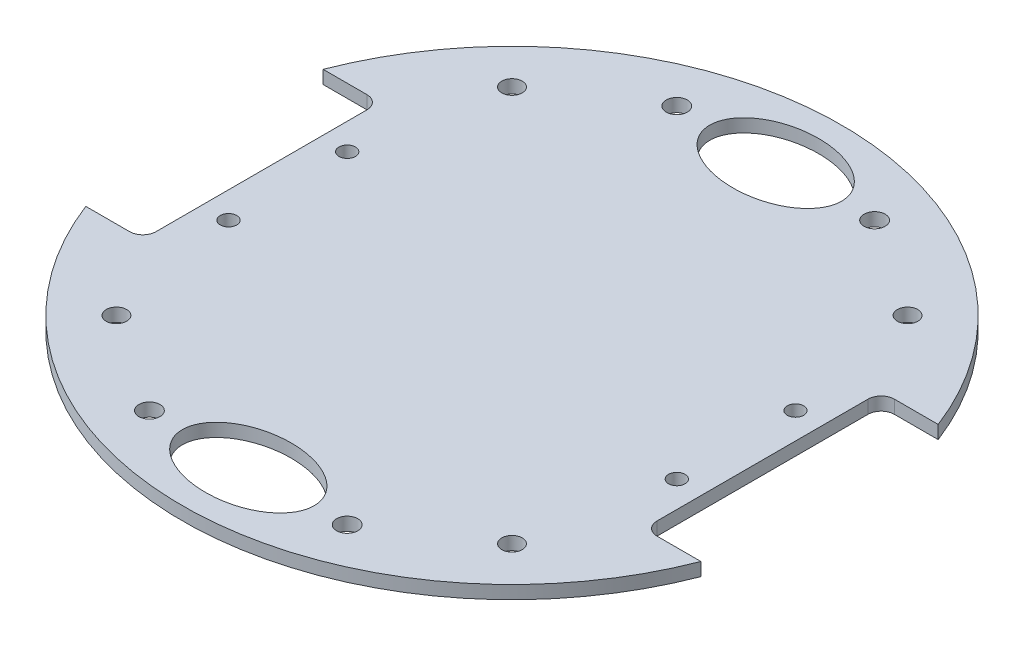
ISO-10303-21;
HEADER;
FILE_DESCRIPTION(('STEP AP214'),'2;1');
FILE_NAME('part.step','',(''),(''),'','','');
FILE_SCHEMA(('AUTOMOTIVE_DESIGN { 1 0 10303 214 1 1 1 1 }'));
ENDSEC;
DATA;
#1=APPLICATION_CONTEXT('core data for automotive mechanical design processes');
#2=APPLICATION_PROTOCOL_DEFINITION('international standard','automotive_design',2000,#1);
#3=PRODUCT_CONTEXT('',#1,'mechanical');
#4=PRODUCT('Part','Part','',(#3));
#5=PRODUCT_RELATED_PRODUCT_CATEGORY('part','',(#4));
#6=PRODUCT_DEFINITION_FORMATION('','',#4);
#7=PRODUCT_DEFINITION_CONTEXT('part definition',#1,'design');
#8=PRODUCT_DEFINITION('design','',#6,#7);
#9=PRODUCT_DEFINITION_SHAPE('','',#8);
#10=(LENGTH_UNIT() NAMED_UNIT(*) SI_UNIT(.MILLI.,.METRE.));
#11=(NAMED_UNIT(*) PLANE_ANGLE_UNIT() SI_UNIT($,.RADIAN.));
#12=(NAMED_UNIT(*) SI_UNIT($,.STERADIAN.) SOLID_ANGLE_UNIT());
#13=UNCERTAINTY_MEASURE_WITH_UNIT(LENGTH_MEASURE(1.E-05),#10,'distance_accuracy_value','');
#14=(GEOMETRIC_REPRESENTATION_CONTEXT(3) GLOBAL_UNCERTAINTY_ASSIGNED_CONTEXT((#13)) GLOBAL_UNIT_ASSIGNED_CONTEXT((#10,
#11,#12)) REPRESENTATION_CONTEXT('',''));
#15=CARTESIAN_POINT('',(0.,0.,0.));
#16=DIRECTION('',(0.,0.,1.));
#17=DIRECTION('',(1.,0.,0.));
#18=AXIS2_PLACEMENT_3D('',#15,#16,#17);
#19=CARTESIAN_POINT('',(46.6476151587624,2.,-18.));
#20=DIRECTION('',(0.,0.,1.));
#21=DIRECTION('',(1.,0.,0.));
#22=AXIS2_PLACEMENT_3D('',#19,#20,#21);
#23=PLANE('',#22);
#24=DIRECTION('',(-1.,0.,0.));
#25=VECTOR('',#24,1.);
#26=CARTESIAN_POINT('',(46.6476151587624,0.,-18.));
#27=LINE('',#26,#25);
#28=CARTESIAN_POINT('',(46.6476151587624,0.,-18.));
#29=VERTEX_POINT('',#28);
#30=CARTESIAN_POINT('',(40.,0.,-18.));
#31=VERTEX_POINT('',#30);
#32=EDGE_CURVE('E158',#29,#31,#27,.T.);
#33=ORIENTED_EDGE('',*,*,#32,.F.);
#34=DIRECTION('',(0.,-1.,0.));
#35=VECTOR('',#34,1.);
#36=CARTESIAN_POINT('',(46.6476151587624,2.,-18.));
#37=LINE('',#36,#35);
#38=CARTESIAN_POINT('',(46.6476151587624,2.,-18.));
#39=VERTEX_POINT('',#38);
#40=EDGE_CURVE('E11',#39,#29,#37,.T.);
#41=ORIENTED_EDGE('',*,*,#40,.F.);
#42=DIRECTION('',(-1.,0.,0.));
#43=VECTOR('',#42,1.);
#44=CARTESIAN_POINT('',(46.6476151587624,2.,-18.));
#45=LINE('',#44,#43);
#46=CARTESIAN_POINT('',(40.,2.,-18.));
#47=VERTEX_POINT('',#46);
#48=EDGE_CURVE('E186',#39,#47,#45,.T.);
#49=ORIENTED_EDGE('',*,*,#48,.T.);
#50=DIRECTION('',(0.,-1.,0.));
#51=VECTOR('',#50,1.);
#52=CARTESIAN_POINT('',(40.,2.,-18.));
#53=LINE('',#52,#51);
#54=EDGE_CURVE('E157',#47,#31,#53,.T.);
#55=ORIENTED_EDGE('',*,*,#54,.T.);
#56=EDGE_LOOP('',(#33,#41,#49,#55));
#57=FACE_BOUND('',#56,.T.);
#58=ADVANCED_FACE('F35',(#57),#23,.T.);
#59=CARTESIAN_POINT('',(0.,2.,0.));
#60=DIRECTION('',(0.,-1.,0.));
#61=DIRECTION('',(0.,0.,-1.));
#62=AXIS2_PLACEMENT_3D('',#59,#60,#61);
#63=CYLINDRICAL_SURFACE('',#62,50.);
#64=CARTESIAN_POINT('',(0.,0.,0.));
#65=DIRECTION('',(0.,1.,0.));
#66=DIRECTION('',(0.,0.,1.));
#67=AXIS2_PLACEMENT_3D('',#64,#65,#66);
#68=CIRCLE('',#67,50.);
#69=CARTESIAN_POINT('',(-46.6476151587624,0.,-18.));
#70=VERTEX_POINT('',#69);
#71=EDGE_CURVE('E92',#29,#70,#68,.T.);
#72=ORIENTED_EDGE('',*,*,#71,.T.);
#73=DIRECTION('',(0.,-1.,0.));
#74=VECTOR('',#73,1.);
#75=CARTESIAN_POINT('',(-46.6476151587624,2.,-18.));
#76=LINE('',#75,#74);
#77=CARTESIAN_POINT('',(-46.6476151587624,2.,-18.));
#78=VERTEX_POINT('',#77);
#79=EDGE_CURVE('E44',#78,#70,#76,.T.);
#80=ORIENTED_EDGE('',*,*,#79,.F.);
#81=CARTESIAN_POINT('',(0.,2.,0.));
#82=DIRECTION('',(0.,1.,0.));
#83=DIRECTION('',(0.,0.,1.));
#84=AXIS2_PLACEMENT_3D('',#81,#82,#83);
#85=CIRCLE('',#84,50.);
#86=EDGE_CURVE('E135',#39,#78,#85,.T.);
#87=ORIENTED_EDGE('',*,*,#86,.F.);
#88=ORIENTED_EDGE('',*,*,#40,.T.);
#89=EDGE_LOOP('',(#72,#80,#87,#88));
#90=FACE_BOUND('',#89,.T.);
#91=ADVANCED_FACE('F351',(#90),#63,.T.);
#92=CARTESIAN_POINT('',(-46.6476151587624,2.,-18.));
#93=DIRECTION('',(0.,0.,-1.));
#94=DIRECTION('',(-1.,0.,0.));
#95=AXIS2_PLACEMENT_3D('',#92,#93,#94);
#96=PLANE('',#95);
#97=DIRECTION('',(1.,0.,0.));
#98=VECTOR('',#97,1.);
#99=CARTESIAN_POINT('',(-46.6476151587624,0.,-18.));
#100=LINE('',#99,#98);
#101=CARTESIAN_POINT('',(-40.,0.,-18.));
#102=VERTEX_POINT('',#101);
#103=EDGE_CURVE('E142',#70,#102,#100,.T.);
#104=ORIENTED_EDGE('',*,*,#103,.T.);
#105=DIRECTION('',(0.,-1.,0.));
#106=VECTOR('',#105,1.);
#107=CARTESIAN_POINT('',(-40.,2.,-18.));
#108=LINE('',#107,#106);
#109=CARTESIAN_POINT('',(-40.,2.,-18.));
#110=VERTEX_POINT('',#109);
#111=EDGE_CURVE('E139',#110,#102,#108,.T.);
#112=ORIENTED_EDGE('',*,*,#111,.F.);
#113=DIRECTION('',(1.,0.,0.));
#114=VECTOR('',#113,1.);
#115=CARTESIAN_POINT('',(-46.6476151587624,2.,-18.));
#116=LINE('',#115,#114);
#117=EDGE_CURVE('E129',#78,#110,#116,.T.);
#118=ORIENTED_EDGE('',*,*,#117,.F.);
#119=ORIENTED_EDGE('',*,*,#79,.T.);
#120=EDGE_LOOP('',(#104,#112,#118,#119));
#121=FACE_BOUND('',#120,.T.);
#122=ADVANCED_FACE('F140',(#121),#96,.F.);
#123=CARTESIAN_POINT('',(-40.,2.,-16.));
#124=DIRECTION('',(0.,-1.,0.));
#125=DIRECTION('',(0.,0.,-1.));
#126=AXIS2_PLACEMENT_3D('',#123,#124,#125);
#127=CYLINDRICAL_SURFACE('',#126,2.);
#128=CARTESIAN_POINT('',(-40.,0.,-16.));
#129=DIRECTION('',(0.,-1.,0.));
#130=DIRECTION('',(0.,0.,-1.));
#131=AXIS2_PLACEMENT_3D('',#128,#129,#130);
#132=CIRCLE('',#131,2.);
#133=CARTESIAN_POINT('',(-38.,0.,-16.));
#134=VERTEX_POINT('',#133);
#135=EDGE_CURVE('E183',#102,#134,#132,.T.);
#136=ORIENTED_EDGE('',*,*,#135,.T.);
#137=DIRECTION('',(0.,-1.,0.));
#138=VECTOR('',#137,1.);
#139=CARTESIAN_POINT('',(-38.,2.,-16.));
#140=LINE('',#139,#138);
#141=CARTESIAN_POINT('',(-38.,2.,-16.));
#142=VERTEX_POINT('',#141);
#143=EDGE_CURVE('E145',#142,#134,#140,.T.);
#144=ORIENTED_EDGE('',*,*,#143,.F.);
#145=CARTESIAN_POINT('',(-40.,2.,-16.));
#146=DIRECTION('',(0.,-1.,0.));
#147=DIRECTION('',(0.,0.,-1.));
#148=AXIS2_PLACEMENT_3D('',#145,#146,#147);
#149=CIRCLE('',#148,2.);
#150=EDGE_CURVE('E133',#110,#142,#149,.T.);
#151=ORIENTED_EDGE('',*,*,#150,.F.);
#152=ORIENTED_EDGE('',*,*,#111,.T.);
#153=EDGE_LOOP('',(#136,#144,#151,#152));
#154=FACE_BOUND('',#153,.T.);
#155=ADVANCED_FACE('F147',(#154),#127,.F.);
#156=CARTESIAN_POINT('',(-38.,2.,-16.));
#157=DIRECTION('',(1.,0.,0.));
#158=DIRECTION('',(0.,0.,-1.));
#159=AXIS2_PLACEMENT_3D('',#156,#157,#158);
#160=PLANE('',#159);
#161=DIRECTION('',(0.,0.,1.));
#162=VECTOR('',#161,1.);
#163=CARTESIAN_POINT('',(-38.,0.,-16.));
#164=LINE('',#163,#162);
#165=CARTESIAN_POINT('',(-38.,0.,16.));
#166=VERTEX_POINT('',#165);
#167=EDGE_CURVE('E181',#134,#166,#164,.T.);
#168=ORIENTED_EDGE('',*,*,#167,.T.);
#169=DIRECTION('',(0.,-1.,0.));
#170=VECTOR('',#169,1.);
#171=CARTESIAN_POINT('',(-38.,2.,16.));
#172=LINE('',#171,#170);
#173=CARTESIAN_POINT('',(-38.,2.,16.));
#174=VERTEX_POINT('',#173);
#175=EDGE_CURVE('E190',#174,#166,#172,.T.);
#176=ORIENTED_EDGE('',*,*,#175,.F.);
#177=DIRECTION('',(0.,0.,1.));
#178=VECTOR('',#177,1.);
#179=CARTESIAN_POINT('',(-38.,2.,-16.));
#180=LINE('',#179,#178);
#181=EDGE_CURVE('E150',#142,#174,#180,.T.);
#182=ORIENTED_EDGE('',*,*,#181,.F.);
#183=ORIENTED_EDGE('',*,*,#143,.T.);
#184=EDGE_LOOP('',(#168,#176,#182,#183));
#185=FACE_BOUND('',#184,.T.);
#186=ADVANCED_FACE('F363',(#185),#160,.F.);
#187=CARTESIAN_POINT('',(-40.,2.,16.));
#188=DIRECTION('',(0.,-1.,0.));
#189=DIRECTION('',(0.,0.,-1.));
#190=AXIS2_PLACEMENT_3D('',#187,#188,#189);
#191=CYLINDRICAL_SURFACE('',#190,2.);
#192=CARTESIAN_POINT('',(-40.,0.,16.));
#193=DIRECTION('',(0.,-1.,0.));
#194=DIRECTION('',(0.,0.,-1.));
#195=AXIS2_PLACEMENT_3D('',#192,#193,#194);
#196=CIRCLE('',#195,2.);
#197=CARTESIAN_POINT('',(-40.,0.,18.));
#198=VERTEX_POINT('',#197);
#199=EDGE_CURVE('E179',#166,#198,#196,.T.);
#200=ORIENTED_EDGE('',*,*,#199,.T.);
#201=DIRECTION('',(0.,-1.,0.));
#202=VECTOR('',#201,1.);
#203=CARTESIAN_POINT('',(-40.,2.,18.));
#204=LINE('',#203,#202);
#205=CARTESIAN_POINT('',(-40.,2.,18.));
#206=VERTEX_POINT('',#205);
#207=EDGE_CURVE('E193',#206,#198,#204,.T.);
#208=ORIENTED_EDGE('',*,*,#207,.F.);
#209=CARTESIAN_POINT('',(-40.,2.,16.));
#210=DIRECTION('',(0.,-1.,0.));
#211=DIRECTION('',(0.,0.,-1.));
#212=AXIS2_PLACEMENT_3D('',#209,#210,#211);
#213=CIRCLE('',#212,2.);
#214=EDGE_CURVE('E152',#174,#206,#213,.T.);
#215=ORIENTED_EDGE('',*,*,#214,.F.);
#216=ORIENTED_EDGE('',*,*,#175,.T.);
#217=EDGE_LOOP('',(#200,#208,#215,#216));
#218=FACE_BOUND('',#217,.T.);
#219=ADVANCED_FACE('F325',(#218),#191,.F.);
#220=CARTESIAN_POINT('',(-40.,2.,18.));
#221=DIRECTION('',(0.,0.,1.));
#222=DIRECTION('',(1.,0.,0.));
#223=AXIS2_PLACEMENT_3D('',#220,#221,#222);
#224=PLANE('',#223);
#225=DIRECTION('',(-1.,0.,0.));
#226=VECTOR('',#225,1.);
#227=CARTESIAN_POINT('',(-40.,0.,18.));
#228=LINE('',#227,#226);
#229=CARTESIAN_POINT('',(-46.6476151587624,0.,18.));
#230=VERTEX_POINT('',#229);
#231=EDGE_CURVE('E177',#198,#230,#228,.T.);
#232=ORIENTED_EDGE('',*,*,#231,.T.);
#233=DIRECTION('',(0.,-1.,0.));
#234=VECTOR('',#233,1.);
#235=CARTESIAN_POINT('',(-46.6476151587624,2.,18.));
#236=LINE('',#235,#234);
#237=CARTESIAN_POINT('',(-46.6476151587624,2.,18.));
#238=VERTEX_POINT('',#237);
#239=EDGE_CURVE('E196',#238,#230,#236,.T.);
#240=ORIENTED_EDGE('',*,*,#239,.F.);
#241=DIRECTION('',(-1.,0.,0.));
#242=VECTOR('',#241,1.);
#243=CARTESIAN_POINT('',(-40.,2.,18.));
#244=LINE('',#243,#242);
#245=EDGE_CURVE('E318',#206,#238,#244,.T.);
#246=ORIENTED_EDGE('',*,*,#245,.F.);
#247=ORIENTED_EDGE('',*,*,#207,.T.);
#248=EDGE_LOOP('',(#232,#240,#246,#247));
#249=FACE_BOUND('',#248,.T.);
#250=ADVANCED_FACE('F329',(#249),#224,.F.);
#251=CARTESIAN_POINT('',(0.,2.,0.));
#252=DIRECTION('',(0.,-1.,0.));
#253=DIRECTION('',(0.,0.,-1.));
#254=AXIS2_PLACEMENT_3D('',#251,#252,#253);
#255=CYLINDRICAL_SURFACE('',#254,50.);
#256=CARTESIAN_POINT('',(0.,0.,0.));
#257=DIRECTION('',(0.,1.,0.));
#258=DIRECTION('',(0.,0.,1.));
#259=AXIS2_PLACEMENT_3D('',#256,#257,#258);
#260=CIRCLE('',#259,50.);
#261=CARTESIAN_POINT('',(46.6476151587624,0.,18.));
#262=VERTEX_POINT('',#261);
#263=EDGE_CURVE('E174',#230,#262,#260,.T.);
#264=ORIENTED_EDGE('',*,*,#263,.T.);
#265=DIRECTION('',(0.,-1.,0.));
#266=VECTOR('',#265,1.);
#267=CARTESIAN_POINT('',(46.6476151587624,2.,18.));
#268=LINE('',#267,#266);
#269=CARTESIAN_POINT('',(46.6476151587624,2.,18.));
#270=VERTEX_POINT('',#269);
#271=EDGE_CURVE('E199',#270,#262,#268,.T.);
#272=ORIENTED_EDGE('',*,*,#271,.F.);
#273=CARTESIAN_POINT('',(0.,2.,0.));
#274=DIRECTION('',(0.,1.,0.));
#275=DIRECTION('',(0.,0.,1.));
#276=AXIS2_PLACEMENT_3D('',#273,#274,#275);
#277=CIRCLE('',#276,50.);
#278=EDGE_CURVE('E316',#238,#270,#277,.T.);
#279=ORIENTED_EDGE('',*,*,#278,.F.);
#280=ORIENTED_EDGE('',*,*,#239,.T.);
#281=EDGE_LOOP('',(#264,#272,#279,#280));
#282=FACE_BOUND('',#281,.T.);
#283=ADVANCED_FACE('F334',(#282),#255,.T.);
#284=CARTESIAN_POINT('',(40.,2.,18.));
#285=DIRECTION('',(0.,0.,-1.));
#286=DIRECTION('',(-1.,0.,0.));
#287=AXIS2_PLACEMENT_3D('',#284,#285,#286);
#288=PLANE('',#287);
#289=DIRECTION('',(1.,0.,0.));
#290=VECTOR('',#289,1.);
#291=CARTESIAN_POINT('',(40.,0.,18.));
#292=LINE('',#291,#290);
#293=CARTESIAN_POINT('',(40.,0.,18.));
#294=VERTEX_POINT('',#293);
#295=EDGE_CURVE('E171',#294,#262,#292,.T.);
#296=ORIENTED_EDGE('',*,*,#295,.F.);
#297=DIRECTION('',(0.,-1.,0.));
#298=VECTOR('',#297,1.);
#299=CARTESIAN_POINT('',(40.,2.,18.));
#300=LINE('',#299,#298);
#301=CARTESIAN_POINT('',(40.,2.,18.));
#302=VERTEX_POINT('',#301);
#303=EDGE_CURVE('E201',#302,#294,#300,.T.);
#304=ORIENTED_EDGE('',*,*,#303,.F.);
#305=DIRECTION('',(1.,0.,0.));
#306=VECTOR('',#305,1.);
#307=CARTESIAN_POINT('',(40.,2.,18.));
#308=LINE('',#307,#306);
#309=EDGE_CURVE('E313',#302,#270,#308,.T.);
#310=ORIENTED_EDGE('',*,*,#309,.T.);
#311=ORIENTED_EDGE('',*,*,#271,.T.);
#312=EDGE_LOOP('',(#296,#304,#310,#311));
#313=FACE_BOUND('',#312,.T.);
#314=ADVANCED_FACE('F340',(#313),#288,.T.);
#315=CARTESIAN_POINT('',(40.,2.,16.));
#316=DIRECTION('',(0.,-1.,0.));
#317=DIRECTION('',(0.,0.,-1.));
#318=AXIS2_PLACEMENT_3D('',#315,#316,#317);
#319=CYLINDRICAL_SURFACE('',#318,2.);
#320=CARTESIAN_POINT('',(40.,0.,16.));
#321=DIRECTION('',(0.,-1.,0.));
#322=DIRECTION('',(0.,0.,-1.));
#323=AXIS2_PLACEMENT_3D('',#320,#321,#322);
#324=CIRCLE('',#323,2.);
#325=CARTESIAN_POINT('',(38.,0.,16.));
#326=VERTEX_POINT('',#325);
#327=EDGE_CURVE('E168',#294,#326,#324,.T.);
#328=ORIENTED_EDGE('',*,*,#327,.T.);
#329=DIRECTION('',(0.,-1.,0.));
#330=VECTOR('',#329,1.);
#331=CARTESIAN_POINT('',(38.,2.,16.));
#332=LINE('',#331,#330);
#333=CARTESIAN_POINT('',(38.,2.,16.));
#334=VERTEX_POINT('',#333);
#335=EDGE_CURVE('E203',#334,#326,#332,.T.);
#336=ORIENTED_EDGE('',*,*,#335,.F.);
#337=CARTESIAN_POINT('',(40.,2.,16.));
#338=DIRECTION('',(0.,-1.,0.));
#339=DIRECTION('',(0.,0.,-1.));
#340=AXIS2_PLACEMENT_3D('',#337,#338,#339);
#341=CIRCLE('',#340,2.);
#342=EDGE_CURVE('E311',#302,#334,#341,.T.);
#343=ORIENTED_EDGE('',*,*,#342,.F.);
#344=ORIENTED_EDGE('',*,*,#303,.T.);
#345=EDGE_LOOP('',(#328,#336,#343,#344));
#346=FACE_BOUND('',#345,.T.);
#347=ADVANCED_FACE('F343',(#346),#319,.F.);
#348=CARTESIAN_POINT('',(38.,2.,-16.));
#349=DIRECTION('',(1.,0.,0.));
#350=DIRECTION('',(0.,0.,-1.));
#351=AXIS2_PLACEMENT_3D('',#348,#349,#350);
#352=PLANE('',#351);
#353=DIRECTION('',(0.,0.,1.));
#354=VECTOR('',#353,1.);
#355=CARTESIAN_POINT('',(38.,0.,-16.));
#356=LINE('',#355,#354);
#357=CARTESIAN_POINT('',(38.,0.,-16.));
#358=VERTEX_POINT('',#357);
#359=EDGE_CURVE('E165',#358,#326,#356,.T.);
#360=ORIENTED_EDGE('',*,*,#359,.F.);
#361=DIRECTION('',(0.,-1.,0.));
#362=VECTOR('',#361,1.);
#363=CARTESIAN_POINT('',(38.,2.,-16.));
#364=LINE('',#363,#362);
#365=CARTESIAN_POINT('',(38.,2.,-16.));
#366=VERTEX_POINT('',#365);
#367=EDGE_CURVE('E205',#366,#358,#364,.T.);
#368=ORIENTED_EDGE('',*,*,#367,.F.);
#369=DIRECTION('',(0.,0.,1.));
#370=VECTOR('',#369,1.);
#371=CARTESIAN_POINT('',(38.,2.,-16.));
#372=LINE('',#371,#370);
#373=EDGE_CURVE('E308',#366,#334,#372,.T.);
#374=ORIENTED_EDGE('',*,*,#373,.T.);
#375=ORIENTED_EDGE('',*,*,#335,.T.);
#376=EDGE_LOOP('',(#360,#368,#374,#375));
#377=FACE_BOUND('',#376,.T.);
#378=ADVANCED_FACE('F346',(#377),#352,.T.);
#379=CARTESIAN_POINT('',(40.,2.,-16.));
#380=DIRECTION('',(0.,-1.,0.));
#381=DIRECTION('',(0.,0.,-1.));
#382=AXIS2_PLACEMENT_3D('',#379,#380,#381);
#383=CYLINDRICAL_SURFACE('',#382,2.);
#384=CARTESIAN_POINT('',(40.,0.,-16.));
#385=DIRECTION('',(0.,-1.,0.));
#386=DIRECTION('',(0.,0.,-1.));
#387=AXIS2_PLACEMENT_3D('',#384,#385,#386);
#388=CIRCLE('',#387,2.);
#389=EDGE_CURVE('E161',#358,#31,#388,.T.);
#390=ORIENTED_EDGE('',*,*,#389,.T.);
#391=ORIENTED_EDGE('',*,*,#54,.F.);
#392=CARTESIAN_POINT('',(40.,2.,-16.));
#393=DIRECTION('',(0.,-1.,0.));
#394=DIRECTION('',(0.,0.,-1.));
#395=AXIS2_PLACEMENT_3D('',#392,#393,#394);
#396=CIRCLE('',#395,2.);
#397=EDGE_CURVE('E102',#366,#47,#396,.T.);
#398=ORIENTED_EDGE('',*,*,#397,.F.);
#399=ORIENTED_EDGE('',*,*,#367,.T.);
#400=EDGE_LOOP('',(#390,#391,#398,#399));
#401=FACE_BOUND('',#400,.T.);
#402=ADVANCED_FACE('F349',(#401),#383,.F.);
#403=CARTESIAN_POINT('',(40.,2.,-16.));
#404=DIRECTION('',(0.,-1.,0.));
#405=DIRECTION('',(0.,0.,-1.));
#406=AXIS2_PLACEMENT_3D('',#403,#404,#405);
#407=PLANE('',#406);
#408=CARTESIAN_POINT('',(34.,2.,-9.));
#409=DIRECTION('',(0.,1.,0.));
#410=DIRECTION('',(0.,0.,-1.));
#411=AXIS2_PLACEMENT_3D('',#408,#409,#410);
#412=CIRCLE('',#411,1.25);
#413=CARTESIAN_POINT('',(34.,2.,-10.25));
#414=VERTEX_POINT('',#413);
#415=EDGE_CURVE('E260',#414,#414,#412,.T.);
#416=ORIENTED_EDGE('',*,*,#415,.F.);
#417=EDGE_LOOP('',(#416));
#418=FACE_BOUND('',#417,.T.);
#419=CARTESIAN_POINT('',(34.,2.,9.));
#420=DIRECTION('',(0.,1.,0.));
#421=DIRECTION('',(0.,0.,1.));
#422=AXIS2_PLACEMENT_3D('',#419,#420,#421);
#423=CIRCLE('',#422,1.25);
#424=CARTESIAN_POINT('',(34.,2.,10.25));
#425=VERTEX_POINT('',#424);
#426=EDGE_CURVE('E250',#425,#425,#423,.T.);
#427=ORIENTED_EDGE('',*,*,#426,.F.);
#428=EDGE_LOOP('',(#427));
#429=FACE_BOUND('',#428,.T.);
#430=CARTESIAN_POINT('',(-34.,2.,9.));
#431=DIRECTION('',(0.,1.,0.));
#432=DIRECTION('',(0.,0.,-1.));
#433=AXIS2_PLACEMENT_3D('',#430,#431,#432);
#434=CIRCLE('',#433,1.25);
#435=CARTESIAN_POINT('',(-34.,2.,7.75));
#436=VERTEX_POINT('',#435);
#437=EDGE_CURVE('E247',#436,#436,#434,.T.);
#438=ORIENTED_EDGE('',*,*,#437,.F.);
#439=EDGE_LOOP('',(#438));
#440=FACE_BOUND('',#439,.T.);
#441=CARTESIAN_POINT('',(-34.,2.,-9.));
#442=DIRECTION('',(0.,1.,0.));
#443=DIRECTION('',(0.,0.,1.));
#444=AXIS2_PLACEMENT_3D('',#441,#442,#443);
#445=CIRCLE('',#444,1.25);
#446=CARTESIAN_POINT('',(-34.,2.,-7.75));
#447=VERTEX_POINT('',#446);
#448=EDGE_CURVE('E244',#447,#447,#445,.T.);
#449=ORIENTED_EDGE('',*,*,#448,.F.);
#450=EDGE_LOOP('',(#449));
#451=FACE_BOUND('',#450,.T.);
#452=CARTESIAN_POINT('',(-15.,2.,40.));
#453=DIRECTION('',(0.,1.,0.));
#454=DIRECTION('',(0.,0.,-1.));
#455=AXIS2_PLACEMENT_3D('',#452,#453,#454);
#456=CIRCLE('',#455,1.6);
#457=CARTESIAN_POINT('',(-15.,2.,38.4));
#458=VERTEX_POINT('',#457);
#459=EDGE_CURVE('E240',#458,#458,#456,.T.);
#460=ORIENTED_EDGE('',*,*,#459,.F.);
#461=EDGE_LOOP('',(#460));
#462=FACE_BOUND('',#461,.T.);
#463=CARTESIAN_POINT('',(15.,2.,40.));
#464=DIRECTION('',(0.,1.,0.));
#465=DIRECTION('',(0.,0.,1.));
#466=AXIS2_PLACEMENT_3D('',#463,#464,#465);
#467=CIRCLE('',#466,1.6);
#468=CARTESIAN_POINT('',(15.,2.,41.6));
#469=VERTEX_POINT('',#468);
#470=EDGE_CURVE('E236',#469,#469,#467,.T.);
#471=ORIENTED_EDGE('',*,*,#470,.F.);
#472=EDGE_LOOP('',(#471));
#473=FACE_BOUND('',#472,.T.);
#474=CARTESIAN_POINT('',(15.,2.,-40.));
#475=DIRECTION('',(0.,1.,0.));
#476=DIRECTION('',(0.,0.,-1.));
#477=AXIS2_PLACEMENT_3D('',#474,#475,#476);
#478=CIRCLE('',#477,1.6);
#479=CARTESIAN_POINT('',(15.,2.,-41.6));
#480=VERTEX_POINT('',#479);
#481=EDGE_CURVE('E232',#480,#480,#478,.T.);
#482=ORIENTED_EDGE('',*,*,#481,.F.);
#483=EDGE_LOOP('',(#482));
#484=FACE_BOUND('',#483,.T.);
#485=CARTESIAN_POINT('',(-15.,2.,-40.));
#486=DIRECTION('',(0.,1.,0.));
#487=DIRECTION('',(0.,0.,1.));
#488=AXIS2_PLACEMENT_3D('',#485,#486,#487);
#489=CIRCLE('',#488,1.6);
#490=CARTESIAN_POINT('',(-15.,2.,-38.4));
#491=VERTEX_POINT('',#490);
#492=EDGE_CURVE('E228',#491,#491,#489,.T.);
#493=ORIENTED_EDGE('',*,*,#492,.F.);
#494=EDGE_LOOP('',(#493));
#495=FACE_BOUND('',#494,.T.);
#496=CARTESIAN_POINT('',(-30.,2.,30.));
#497=DIRECTION('',(0.,1.,0.));
#498=DIRECTION('',(0.,0.,-1.));
#499=AXIS2_PLACEMENT_3D('',#496,#497,#498);
#500=CIRCLE('',#499,1.55);
#501=CARTESIAN_POINT('',(-30.,2.,28.45));
#502=VERTEX_POINT('',#501);
#503=EDGE_CURVE('E224',#502,#502,#500,.T.);
#504=ORIENTED_EDGE('',*,*,#503,.F.);
#505=EDGE_LOOP('',(#504));
#506=FACE_BOUND('',#505,.T.);
#507=CARTESIAN_POINT('',(30.,2.,30.));
#508=DIRECTION('',(0.,1.,0.));
#509=DIRECTION('',(0.,0.,1.));
#510=AXIS2_PLACEMENT_3D('',#507,#508,#509);
#511=CIRCLE('',#510,1.55);
#512=CARTESIAN_POINT('',(30.,2.,31.55));
#513=VERTEX_POINT('',#512);
#514=EDGE_CURVE('E220',#513,#513,#511,.T.);
#515=ORIENTED_EDGE('',*,*,#514,.F.);
#516=EDGE_LOOP('',(#515));
#517=FACE_BOUND('',#516,.T.);
#518=CARTESIAN_POINT('',(30.,2.,-30.));
#519=DIRECTION('',(0.,1.,0.));
#520=DIRECTION('',(0.,0.,-1.));
#521=AXIS2_PLACEMENT_3D('',#518,#519,#520);
#522=CIRCLE('',#521,1.55);
#523=CARTESIAN_POINT('',(30.,2.,-31.55));
#524=VERTEX_POINT('',#523);
#525=EDGE_CURVE('E216',#524,#524,#522,.T.);
#526=ORIENTED_EDGE('',*,*,#525,.F.);
#527=EDGE_LOOP('',(#526));
#528=FACE_BOUND('',#527,.T.);
#529=CARTESIAN_POINT('',(-30.,2.,-30.));
#530=DIRECTION('',(0.,1.,0.));
#531=DIRECTION('',(0.,0.,1.));
#532=AXIS2_PLACEMENT_3D('',#529,#530,#531);
#533=CIRCLE('',#532,1.55);
#534=CARTESIAN_POINT('',(-30.,2.,-28.45));
#535=VERTEX_POINT('',#534);
#536=EDGE_CURVE('E212',#535,#535,#533,.T.);
#537=ORIENTED_EDGE('',*,*,#536,.F.);
#538=EDGE_LOOP('',(#537));
#539=FACE_BOUND('',#538,.T.);
#540=CARTESIAN_POINT('',(0.,2.,40.));
#541=DIRECTION('',(0.,1.,0.));
#542=DIRECTION('',(-1.,0.,0.));
#543=AXIS2_PLACEMENT_3D('',#540,#541,#542);
#544=ELLIPSE('',#543,10.,6.5);
#545=CARTESIAN_POINT('',(-10.,2.,40.));
#546=VERTEX_POINT('',#545);
#547=EDGE_CURVE('E211',#546,#546,#544,.T.);
#548=ORIENTED_EDGE('',*,*,#547,.F.);
#549=EDGE_LOOP('',(#548));
#550=FACE_BOUND('',#549,.T.);
#551=CARTESIAN_POINT('',(0.,2.,-40.));
#552=DIRECTION('',(0.,1.,0.));
#553=DIRECTION('',(-1.,0.,0.));
#554=AXIS2_PLACEMENT_3D('',#551,#552,#553);
#555=ELLIPSE('',#554,10.,6.5);
#556=CARTESIAN_POINT('',(-10.,2.,-40.));
#557=VERTEX_POINT('',#556);
#558=EDGE_CURVE('E285',#557,#557,#555,.T.);
#559=ORIENTED_EDGE('',*,*,#558,.F.);
#560=EDGE_LOOP('',(#559));
#561=FACE_BOUND('',#560,.T.);
#562=ORIENTED_EDGE('',*,*,#48,.F.);
#563=ORIENTED_EDGE('',*,*,#86,.T.);
#564=ORIENTED_EDGE('',*,*,#117,.T.);
#565=ORIENTED_EDGE('',*,*,#150,.T.);
#566=ORIENTED_EDGE('',*,*,#181,.T.);
#567=ORIENTED_EDGE('',*,*,#214,.T.);
#568=ORIENTED_EDGE('',*,*,#245,.T.);
#569=ORIENTED_EDGE('',*,*,#278,.T.);
#570=ORIENTED_EDGE('',*,*,#309,.F.);
#571=ORIENTED_EDGE('',*,*,#342,.T.);
#572=ORIENTED_EDGE('',*,*,#373,.F.);
#573=ORIENTED_EDGE('',*,*,#397,.T.);
#574=EDGE_LOOP('',(#562,#563,#564,#565,#566,#567,#568,#569,#570,#571,#572,#573));
#575=FACE_BOUND('',#574,.T.);
#576=ADVANCED_FACE('F131',(#418,#429,#440,#451,#462,#473,#484,#495,#506,#517,#528,#539,#550,
#561,#575),#407,.F.);
#577=CARTESIAN_POINT('',(40.,0.,-16.));
#578=DIRECTION('',(0.,-1.,0.));
#579=DIRECTION('',(0.,0.,-1.));
#580=AXIS2_PLACEMENT_3D('',#577,#578,#579);
#581=PLANE('',#580);
#582=CARTESIAN_POINT('',(34.,0.,-9.));
#583=DIRECTION('',(0.,-1.,0.));
#584=DIRECTION('',(0.,0.,-1.));
#585=AXIS2_PLACEMENT_3D('',#582,#583,#584);
#586=CIRCLE('',#585,1.25);
#587=CARTESIAN_POINT('',(34.,0.,-10.25));
#588=VERTEX_POINT('',#587);
#589=EDGE_CURVE('E38',#588,#588,#586,.T.);
#590=ORIENTED_EDGE('',*,*,#589,.F.);
#591=EDGE_LOOP('',(#590));
#592=FACE_BOUND('',#591,.T.);
#593=CARTESIAN_POINT('',(34.,0.,9.));
#594=DIRECTION('',(0.,-1.,0.));
#595=DIRECTION('',(0.,0.,-1.));
#596=AXIS2_PLACEMENT_3D('',#593,#594,#595);
#597=CIRCLE('',#596,1.25);
#598=CARTESIAN_POINT('',(34.,0.,7.75));
#599=VERTEX_POINT('',#598);
#600=EDGE_CURVE('E248',#599,#599,#597,.T.);
#601=ORIENTED_EDGE('',*,*,#600,.F.);
#602=EDGE_LOOP('',(#601));
#603=FACE_BOUND('',#602,.T.);
#604=CARTESIAN_POINT('',(-34.,0.,9.));
#605=DIRECTION('',(0.,-1.,0.));
#606=DIRECTION('',(0.,0.,-1.));
#607=AXIS2_PLACEMENT_3D('',#604,#605,#606);
#608=CIRCLE('',#607,1.25);
#609=CARTESIAN_POINT('',(-34.,0.,7.75));
#610=VERTEX_POINT('',#609);
#611=EDGE_CURVE('E245',#610,#610,#608,.T.);
#612=ORIENTED_EDGE('',*,*,#611,.F.);
#613=EDGE_LOOP('',(#612));
#614=FACE_BOUND('',#613,.T.);
#615=CARTESIAN_POINT('',(-34.,0.,-9.));
#616=DIRECTION('',(0.,-1.,0.));
#617=DIRECTION('',(0.,0.,-1.));
#618=AXIS2_PLACEMENT_3D('',#615,#616,#617);
#619=CIRCLE('',#618,1.25);
#620=CARTESIAN_POINT('',(-34.,0.,-10.25));
#621=VERTEX_POINT('',#620);
#622=EDGE_CURVE('E241',#621,#621,#619,.T.);
#623=ORIENTED_EDGE('',*,*,#622,.F.);
#624=EDGE_LOOP('',(#623));
#625=FACE_BOUND('',#624,.T.);
#626=CARTESIAN_POINT('',(-15.,0.,40.));
#627=DIRECTION('',(0.,-1.,0.));
#628=DIRECTION('',(0.,0.,-1.));
#629=AXIS2_PLACEMENT_3D('',#626,#627,#628);
#630=CIRCLE('',#629,1.6);
#631=CARTESIAN_POINT('',(-15.,0.,38.4));
#632=VERTEX_POINT('',#631);
#633=EDGE_CURVE('E237',#632,#632,#630,.T.);
#634=ORIENTED_EDGE('',*,*,#633,.F.);
#635=EDGE_LOOP('',(#634));
#636=FACE_BOUND('',#635,.T.);
#637=CARTESIAN_POINT('',(15.,0.,40.));
#638=DIRECTION('',(0.,-1.,0.));
#639=DIRECTION('',(0.,0.,-1.));
#640=AXIS2_PLACEMENT_3D('',#637,#638,#639);
#641=CIRCLE('',#640,1.6);
#642=CARTESIAN_POINT('',(15.,0.,38.4));
#643=VERTEX_POINT('',#642);
#644=EDGE_CURVE('E233',#643,#643,#641,.T.);
#645=ORIENTED_EDGE('',*,*,#644,.F.);
#646=EDGE_LOOP('',(#645));
#647=FACE_BOUND('',#646,.T.);
#648=CARTESIAN_POINT('',(15.,0.,-40.));
#649=DIRECTION('',(0.,-1.,0.));
#650=DIRECTION('',(0.,0.,-1.));
#651=AXIS2_PLACEMENT_3D('',#648,#649,#650);
#652=CIRCLE('',#651,1.6);
#653=CARTESIAN_POINT('',(15.,0.,-41.6));
#654=VERTEX_POINT('',#653);
#655=EDGE_CURVE('E229',#654,#654,#652,.T.);
#656=ORIENTED_EDGE('',*,*,#655,.F.);
#657=EDGE_LOOP('',(#656));
#658=FACE_BOUND('',#657,.T.);
#659=CARTESIAN_POINT('',(-15.,0.,-40.));
#660=DIRECTION('',(0.,-1.,0.));
#661=DIRECTION('',(0.,0.,-1.));
#662=AXIS2_PLACEMENT_3D('',#659,#660,#661);
#663=CIRCLE('',#662,1.6);
#664=CARTESIAN_POINT('',(-15.,0.,-41.6));
#665=VERTEX_POINT('',#664);
#666=EDGE_CURVE('E225',#665,#665,#663,.T.);
#667=ORIENTED_EDGE('',*,*,#666,.F.);
#668=EDGE_LOOP('',(#667));
#669=FACE_BOUND('',#668,.T.);
#670=CARTESIAN_POINT('',(-30.,0.,30.));
#671=DIRECTION('',(0.,-1.,0.));
#672=DIRECTION('',(0.,0.,-1.));
#673=AXIS2_PLACEMENT_3D('',#670,#671,#672);
#674=CIRCLE('',#673,1.55);
#675=CARTESIAN_POINT('',(-30.,0.,28.45));
#676=VERTEX_POINT('',#675);
#677=EDGE_CURVE('E221',#676,#676,#674,.T.);
#678=ORIENTED_EDGE('',*,*,#677,.F.);
#679=EDGE_LOOP('',(#678));
#680=FACE_BOUND('',#679,.T.);
#681=CARTESIAN_POINT('',(30.,0.,30.));
#682=DIRECTION('',(0.,-1.,0.));
#683=DIRECTION('',(0.,0.,-1.));
#684=AXIS2_PLACEMENT_3D('',#681,#682,#683);
#685=CIRCLE('',#684,1.55);
#686=CARTESIAN_POINT('',(30.,0.,28.45));
#687=VERTEX_POINT('',#686);
#688=EDGE_CURVE('E217',#687,#687,#685,.T.);
#689=ORIENTED_EDGE('',*,*,#688,.F.);
#690=EDGE_LOOP('',(#689));
#691=FACE_BOUND('',#690,.T.);
#692=CARTESIAN_POINT('',(30.,0.,-30.));
#693=DIRECTION('',(0.,-1.,0.));
#694=DIRECTION('',(0.,0.,-1.));
#695=AXIS2_PLACEMENT_3D('',#692,#693,#694);
#696=CIRCLE('',#695,1.55);
#697=CARTESIAN_POINT('',(30.,0.,-31.55));
#698=VERTEX_POINT('',#697);
#699=EDGE_CURVE('E213',#698,#698,#696,.T.);
#700=ORIENTED_EDGE('',*,*,#699,.F.);
#701=EDGE_LOOP('',(#700));
#702=FACE_BOUND('',#701,.T.);
#703=CARTESIAN_POINT('',(-30.,0.,-30.));
#704=DIRECTION('',(0.,-1.,0.));
#705=DIRECTION('',(0.,0.,-1.));
#706=AXIS2_PLACEMENT_3D('',#703,#704,#705);
#707=CIRCLE('',#706,1.55);
#708=CARTESIAN_POINT('',(-30.,0.,-31.55));
#709=VERTEX_POINT('',#708);
#710=EDGE_CURVE('E208',#709,#709,#707,.T.);
#711=ORIENTED_EDGE('',*,*,#710,.F.);
#712=EDGE_LOOP('',(#711));
#713=FACE_BOUND('',#712,.T.);
#714=CARTESIAN_POINT('',(0.,0.,40.));
#715=DIRECTION('',(0.,1.,0.));
#716=DIRECTION('',(-1.,0.,0.));
#717=AXIS2_PLACEMENT_3D('',#714,#715,#716);
#718=ELLIPSE('',#717,10.,6.5);
#719=CARTESIAN_POINT('',(-10.,0.,40.));
#720=VERTEX_POINT('',#719);
#721=EDGE_CURVE('E281',#720,#720,#718,.T.);
#722=ORIENTED_EDGE('',*,*,#721,.T.);
#723=EDGE_LOOP('',(#722));
#724=FACE_BOUND('',#723,.T.);
#725=CARTESIAN_POINT('',(0.,0.,-40.));
#726=DIRECTION('',(0.,1.,0.));
#727=DIRECTION('',(-1.,0.,0.));
#728=AXIS2_PLACEMENT_3D('',#725,#726,#727);
#729=ELLIPSE('',#728,10.,6.5);
#730=CARTESIAN_POINT('',(-10.,0.,-40.));
#731=VERTEX_POINT('',#730);
#732=EDGE_CURVE('E162',#731,#731,#729,.T.);
#733=ORIENTED_EDGE('',*,*,#732,.T.);
#734=EDGE_LOOP('',(#733));
#735=FACE_BOUND('',#734,.T.);
#736=ORIENTED_EDGE('',*,*,#32,.T.);
#737=ORIENTED_EDGE('',*,*,#389,.F.);
#738=ORIENTED_EDGE('',*,*,#359,.T.);
#739=ORIENTED_EDGE('',*,*,#327,.F.);
#740=ORIENTED_EDGE('',*,*,#295,.T.);
#741=ORIENTED_EDGE('',*,*,#263,.F.);
#742=ORIENTED_EDGE('',*,*,#231,.F.);
#743=ORIENTED_EDGE('',*,*,#199,.F.);
#744=ORIENTED_EDGE('',*,*,#167,.F.);
#745=ORIENTED_EDGE('',*,*,#135,.F.);
#746=ORIENTED_EDGE('',*,*,#103,.F.);
#747=ORIENTED_EDGE('',*,*,#71,.F.);
#748=EDGE_LOOP('',(#736,#737,#738,#739,#740,#741,#742,#743,#744,#745,#746,#747));
#749=FACE_BOUND('',#748,.T.);
#750=ADVANCED_FACE('F298',(#592,#603,#614,#625,#636,#647,#658,#669,#680,#691,#702,#713,#724,
#735,#749),#581,.T.);
#751=DIRECTION('',(0.,1.,0.));
#752=VECTOR('',#751,1.);
#753=SURFACE_OF_LINEAR_EXTRUSION('',#729,#752);
#754=ORIENTED_EDGE('',*,*,#732,.F.);
#755=EDGE_LOOP('',(#754));
#756=FACE_BOUND('',#755,.T.);
#757=ORIENTED_EDGE('',*,*,#558,.T.);
#758=EDGE_LOOP('',(#757));
#759=FACE_BOUND('',#758,.T.);
#760=ADVANCED_FACE('F293',(#756,#759),#753,.F.);
#761=DIRECTION('',(0.,1.,0.));
#762=VECTOR('',#761,1.);
#763=SURFACE_OF_LINEAR_EXTRUSION('',#718,#762);
#764=ORIENTED_EDGE('',*,*,#721,.F.);
#765=EDGE_LOOP('',(#764));
#766=FACE_BOUND('',#765,.T.);
#767=ORIENTED_EDGE('',*,*,#547,.T.);
#768=EDGE_LOOP('',(#767));
#769=FACE_BOUND('',#768,.T.);
#770=ADVANCED_FACE('F288',(#766,#769),#763,.F.);
#771=CARTESIAN_POINT('',(-30.,-8.,-30.));
#772=DIRECTION('',(0.,1.,0.));
#773=DIRECTION('',(0.,0.,1.));
#774=AXIS2_PLACEMENT_3D('',#771,#772,#773);
#775=CYLINDRICAL_SURFACE('',#774,1.55);
#776=ORIENTED_EDGE('',*,*,#710,.T.);
#777=EDGE_LOOP('',(#776));
#778=FACE_BOUND('',#777,.T.);
#779=ORIENTED_EDGE('',*,*,#536,.T.);
#780=EDGE_LOOP('',(#779));
#781=FACE_BOUND('',#780,.T.);
#782=ADVANCED_FACE('F292',(#778,#781),#775,.F.);
#783=CARTESIAN_POINT('',(30.,-8.,-30.));
#784=DIRECTION('',(0.,1.,0.));
#785=DIRECTION('',(0.,0.,1.));
#786=AXIS2_PLACEMENT_3D('',#783,#784,#785);
#787=CYLINDRICAL_SURFACE('',#786,1.55);
#788=ORIENTED_EDGE('',*,*,#699,.T.);
#789=EDGE_LOOP('',(#788));
#790=FACE_BOUND('',#789,.T.);
#791=ORIENTED_EDGE('',*,*,#525,.T.);
#792=EDGE_LOOP('',(#791));
#793=FACE_BOUND('',#792,.T.);
#794=ADVANCED_FACE('F419',(#790,#793),#787,.F.);
#795=CARTESIAN_POINT('',(30.,-8.,30.));
#796=DIRECTION('',(0.,1.,0.));
#797=DIRECTION('',(0.,0.,1.));
#798=AXIS2_PLACEMENT_3D('',#795,#796,#797);
#799=CYLINDRICAL_SURFACE('',#798,1.55);
#800=ORIENTED_EDGE('',*,*,#688,.T.);
#801=EDGE_LOOP('',(#800));
#802=FACE_BOUND('',#801,.T.);
#803=ORIENTED_EDGE('',*,*,#514,.T.);
#804=EDGE_LOOP('',(#803));
#805=FACE_BOUND('',#804,.T.);
#806=ADVANCED_FACE('F424',(#802,#805),#799,.F.);
#807=CARTESIAN_POINT('',(-30.,-8.,30.));
#808=DIRECTION('',(0.,1.,0.));
#809=DIRECTION('',(0.,0.,1.));
#810=AXIS2_PLACEMENT_3D('',#807,#808,#809);
#811=CYLINDRICAL_SURFACE('',#810,1.55);
#812=ORIENTED_EDGE('',*,*,#677,.T.);
#813=EDGE_LOOP('',(#812));
#814=FACE_BOUND('',#813,.T.);
#815=ORIENTED_EDGE('',*,*,#503,.T.);
#816=EDGE_LOOP('',(#815));
#817=FACE_BOUND('',#816,.T.);
#818=ADVANCED_FACE('F437',(#814,#817),#811,.F.);
#819=CARTESIAN_POINT('',(-15.,-8.,-40.));
#820=DIRECTION('',(0.,1.,0.));
#821=DIRECTION('',(0.,0.,1.));
#822=AXIS2_PLACEMENT_3D('',#819,#820,#821);
#823=CYLINDRICAL_SURFACE('',#822,1.6);
#824=ORIENTED_EDGE('',*,*,#666,.T.);
#825=EDGE_LOOP('',(#824));
#826=FACE_BOUND('',#825,.T.);
#827=ORIENTED_EDGE('',*,*,#492,.T.);
#828=EDGE_LOOP('',(#827));
#829=FACE_BOUND('',#828,.T.);
#830=ADVANCED_FACE('F444',(#826,#829),#823,.F.);
#831=CARTESIAN_POINT('',(15.,-8.,-40.));
#832=DIRECTION('',(0.,1.,0.));
#833=DIRECTION('',(0.,0.,1.));
#834=AXIS2_PLACEMENT_3D('',#831,#832,#833);
#835=CYLINDRICAL_SURFACE('',#834,1.6);
#836=ORIENTED_EDGE('',*,*,#655,.T.);
#837=EDGE_LOOP('',(#836));
#838=FACE_BOUND('',#837,.T.);
#839=ORIENTED_EDGE('',*,*,#481,.T.);
#840=EDGE_LOOP('',(#839));
#841=FACE_BOUND('',#840,.T.);
#842=ADVANCED_FACE('F448',(#838,#841),#835,.F.);
#843=CARTESIAN_POINT('',(15.,-8.,40.));
#844=DIRECTION('',(0.,1.,0.));
#845=DIRECTION('',(0.,0.,1.));
#846=AXIS2_PLACEMENT_3D('',#843,#844,#845);
#847=CYLINDRICAL_SURFACE('',#846,1.6);
#848=ORIENTED_EDGE('',*,*,#644,.T.);
#849=EDGE_LOOP('',(#848));
#850=FACE_BOUND('',#849,.T.);
#851=ORIENTED_EDGE('',*,*,#470,.T.);
#852=EDGE_LOOP('',(#851));
#853=FACE_BOUND('',#852,.T.);
#854=ADVANCED_FACE('F452',(#850,#853),#847,.F.);
#855=CARTESIAN_POINT('',(-15.,-8.,40.));
#856=DIRECTION('',(0.,1.,0.));
#857=DIRECTION('',(0.,0.,1.));
#858=AXIS2_PLACEMENT_3D('',#855,#856,#857);
#859=CYLINDRICAL_SURFACE('',#858,1.6);
#860=ORIENTED_EDGE('',*,*,#633,.T.);
#861=EDGE_LOOP('',(#860));
#862=FACE_BOUND('',#861,.T.);
#863=ORIENTED_EDGE('',*,*,#459,.T.);
#864=EDGE_LOOP('',(#863));
#865=FACE_BOUND('',#864,.T.);
#866=ADVANCED_FACE('F456',(#862,#865),#859,.F.);
#867=CARTESIAN_POINT('',(-34.,-8.,-9.));
#868=DIRECTION('',(0.,1.,0.));
#869=DIRECTION('',(0.,0.,1.));
#870=AXIS2_PLACEMENT_3D('',#867,#868,#869);
#871=CYLINDRICAL_SURFACE('',#870,1.25);
#872=ORIENTED_EDGE('',*,*,#622,.T.);
#873=EDGE_LOOP('',(#872));
#874=FACE_BOUND('',#873,.T.);
#875=ORIENTED_EDGE('',*,*,#448,.T.);
#876=EDGE_LOOP('',(#875));
#877=FACE_BOUND('',#876,.T.);
#878=ADVANCED_FACE('F460',(#874,#877),#871,.F.);
#879=CARTESIAN_POINT('',(-34.,-8.,9.));
#880=DIRECTION('',(0.,1.,0.));
#881=DIRECTION('',(0.,0.,1.));
#882=AXIS2_PLACEMENT_3D('',#879,#880,#881);
#883=CYLINDRICAL_SURFACE('',#882,1.25);
#884=ORIENTED_EDGE('',*,*,#611,.T.);
#885=EDGE_LOOP('',(#884));
#886=FACE_BOUND('',#885,.T.);
#887=ORIENTED_EDGE('',*,*,#437,.T.);
#888=EDGE_LOOP('',(#887));
#889=FACE_BOUND('',#888,.T.);
#890=ADVANCED_FACE('F464',(#886,#889),#883,.F.);
#891=CARTESIAN_POINT('',(34.,-8.,9.));
#892=DIRECTION('',(0.,1.,0.));
#893=DIRECTION('',(0.,0.,1.));
#894=AXIS2_PLACEMENT_3D('',#891,#892,#893);
#895=CYLINDRICAL_SURFACE('',#894,1.25);
#896=ORIENTED_EDGE('',*,*,#600,.T.);
#897=EDGE_LOOP('',(#896));
#898=FACE_BOUND('',#897,.T.);
#899=ORIENTED_EDGE('',*,*,#426,.T.);
#900=EDGE_LOOP('',(#899));
#901=FACE_BOUND('',#900,.T.);
#902=ADVANCED_FACE('F468',(#898,#901),#895,.F.);
#903=CARTESIAN_POINT('',(34.,-8.,-9.));
#904=DIRECTION('',(0.,1.,0.));
#905=DIRECTION('',(0.,0.,1.));
#906=AXIS2_PLACEMENT_3D('',#903,#904,#905);
#907=CYLINDRICAL_SURFACE('',#906,1.25);
#908=ORIENTED_EDGE('',*,*,#589,.T.);
#909=EDGE_LOOP('',(#908));
#910=FACE_BOUND('',#909,.T.);
#911=ORIENTED_EDGE('',*,*,#415,.T.);
#912=EDGE_LOOP('',(#911));
#913=FACE_BOUND('',#912,.T.);
#914=ADVANCED_FACE('F472',(#910,#913),#907,.F.);
#915=CLOSED_SHELL('',(#58,#91,#122,#155,#186,#219,#250,#283,#314,#347,#378,#402,#576,#750,#760,
#770,#782,#794,#806,#818,#830,#842,#854,#866,#878,#890,#902,#914));
#916=MANIFOLD_SOLID_BREP('B2',#915);
#917=ADVANCED_BREP_SHAPE_REPRESENTATION('',(#18,#916),#14);
#918=SHAPE_DEFINITION_REPRESENTATION(#9,#917);
ENDSEC;
END-ISO-10303-21;
